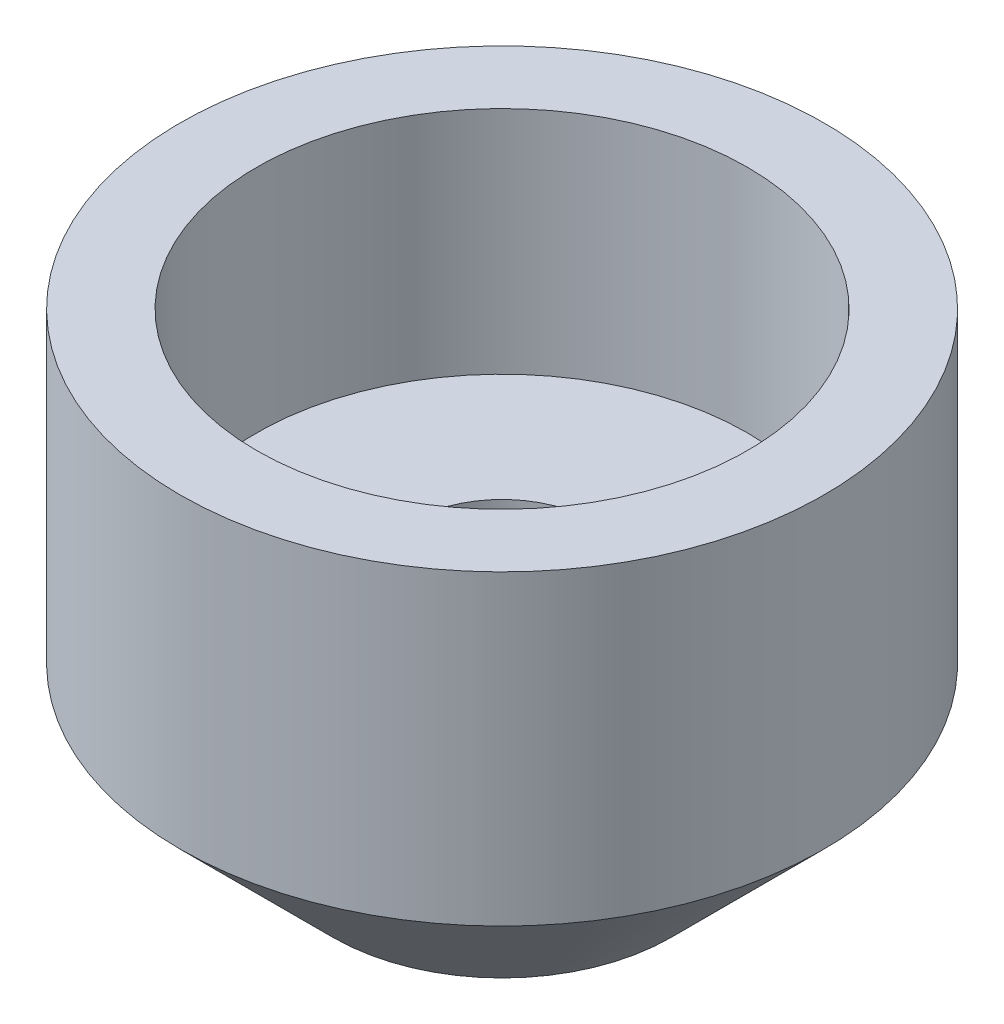
ISO-10303-21;
HEADER;
FILE_DESCRIPTION(('STEP AP214'),'2;1');
FILE_NAME('part.step','',(''),(''),'','','');
FILE_SCHEMA(('AUTOMOTIVE_DESIGN { 1 0 10303 214 1 1 1 1 }'));
ENDSEC;
DATA;
#1=APPLICATION_CONTEXT('core data for automotive mechanical design processes');
#2=APPLICATION_PROTOCOL_DEFINITION('international standard','automotive_design',2000,#1);
#3=PRODUCT_CONTEXT('',#1,'mechanical');
#4=PRODUCT('Part','Part','',(#3));
#5=PRODUCT_RELATED_PRODUCT_CATEGORY('part','',(#4));
#6=PRODUCT_DEFINITION_FORMATION('','',#4);
#7=PRODUCT_DEFINITION_CONTEXT('part definition',#1,'design');
#8=PRODUCT_DEFINITION('design','',#6,#7);
#9=PRODUCT_DEFINITION_SHAPE('','',#8);
#10=(LENGTH_UNIT() NAMED_UNIT(*) SI_UNIT(.MILLI.,.METRE.));
#11=(NAMED_UNIT(*) PLANE_ANGLE_UNIT() SI_UNIT($,.RADIAN.));
#12=(NAMED_UNIT(*) SI_UNIT($,.STERADIAN.) SOLID_ANGLE_UNIT());
#13=UNCERTAINTY_MEASURE_WITH_UNIT(LENGTH_MEASURE(1.E-05),#10,'distance_accuracy_value','');
#14=(GEOMETRIC_REPRESENTATION_CONTEXT(3) GLOBAL_UNCERTAINTY_ASSIGNED_CONTEXT((#13)) GLOBAL_UNIT_ASSIGNED_CONTEXT((#10,
#11,#12)) REPRESENTATION_CONTEXT('',''));
#15=CARTESIAN_POINT('',(0.,0.,0.));
#16=DIRECTION('',(0.,0.,1.));
#17=DIRECTION('',(1.,0.,0.));
#18=AXIS2_PLACEMENT_3D('',#15,#16,#17);
#19=CARTESIAN_POINT('',(0.,15.,0.));
#20=DIRECTION('',(0.,-1.,0.));
#21=DIRECTION('',(0.,0.,-1.));
#22=AXIS2_PLACEMENT_3D('',#19,#20,#21);
#23=CYLINDRICAL_SURFACE('',#22,10.5);
#24=CARTESIAN_POINT('',(0.,5.00000000000001,0.));
#25=DIRECTION('',(0.,1.,0.));
#26=DIRECTION('',(0.,0.,1.));
#27=AXIS2_PLACEMENT_3D('',#24,#25,#26);
#28=CIRCLE('',#27,10.5);
#29=CARTESIAN_POINT('',(0.,5.00000000000001,10.5));
#30=VERTEX_POINT('',#29);
#31=EDGE_CURVE('E41',#30,#30,#28,.T.);
#32=ORIENTED_EDGE('',*,*,#31,.T.);
#33=EDGE_LOOP('',(#32));
#34=FACE_BOUND('',#33,.T.);
#35=CARTESIAN_POINT('',(0.,15.,0.));
#36=DIRECTION('',(0.,1.,0.));
#37=DIRECTION('',(0.,0.,1.));
#38=AXIS2_PLACEMENT_3D('',#35,#36,#37);
#39=CIRCLE('',#38,10.5);
#40=CARTESIAN_POINT('',(0.,15.,10.5));
#41=VERTEX_POINT('',#40);
#42=EDGE_CURVE('E45',#41,#41,#39,.T.);
#43=ORIENTED_EDGE('',*,*,#42,.F.);
#44=EDGE_LOOP('',(#43));
#45=FACE_BOUND('',#44,.T.);
#46=ADVANCED_FACE('F34',(#34,#45),#23,.T.);
#47=CARTESIAN_POINT('',(0.,15.,0.));
#48=DIRECTION('',(0.,1.,0.));
#49=DIRECTION('',(0.,0.,1.));
#50=AXIS2_PLACEMENT_3D('',#47,#48,#49);
#51=PLANE('',#50);
#52=CARTESIAN_POINT('',(0.,15.,0.));
#53=DIRECTION('',(0.,1.,0.));
#54=DIRECTION('',(0.,0.,1.));
#55=AXIS2_PLACEMENT_3D('',#52,#53,#54);
#56=CIRCLE('',#55,8.);
#57=CARTESIAN_POINT('',(0.,15.,8.));
#58=VERTEX_POINT('',#57);
#59=EDGE_CURVE('E52',#58,#58,#56,.T.);
#60=ORIENTED_EDGE('',*,*,#59,.F.);
#61=EDGE_LOOP('',(#60));
#62=FACE_BOUND('',#61,.T.);
#63=ORIENTED_EDGE('',*,*,#42,.T.);
#64=EDGE_LOOP('',(#63));
#65=FACE_BOUND('',#64,.T.);
#66=ADVANCED_FACE('F76',(#62,#65),#51,.T.);
#67=CARTESIAN_POINT('',(0.,0.,0.));
#68=DIRECTION('',(0.,1.,0.));
#69=DIRECTION('',(0.,0.,1.));
#70=AXIS2_PLACEMENT_3D('',#67,#68,#69);
#71=PLANE('',#70);
#72=CARTESIAN_POINT('',(0.,0.,0.));
#73=DIRECTION('',(0.,1.,0.));
#74=DIRECTION('',(0.,0.,1.));
#75=AXIS2_PLACEMENT_3D('',#72,#73,#74);
#76=CIRCLE('',#75,5.49999999999997);
#77=CARTESIAN_POINT('',(0.,0.,5.49999999999997));
#78=VERTEX_POINT('',#77);
#79=EDGE_CURVE('E10',#78,#78,#76,.F.);
#80=ORIENTED_EDGE('',*,*,#79,.T.);
#81=EDGE_LOOP('',(#80));
#82=FACE_BOUND('',#81,.T.);
#83=CARTESIAN_POINT('',(0.,0.,0.));
#84=DIRECTION('',(0.,-1.,0.));
#85=DIRECTION('',(0.,0.,-1.));
#86=AXIS2_PLACEMENT_3D('',#83,#84,#85);
#87=CIRCLE('',#86,3.);
#88=CARTESIAN_POINT('',(0.,0.,-3.));
#89=VERTEX_POINT('',#88);
#90=EDGE_CURVE('E58',#89,#89,#87,.T.);
#91=ORIENTED_EDGE('',*,*,#90,.F.);
#92=EDGE_LOOP('',(#91));
#93=FACE_BOUND('',#92,.T.);
#94=ADVANCED_FACE('F73',(#82,#93),#71,.F.);
#95=CARTESIAN_POINT('',(0.,7.5,0.));
#96=DIRECTION('',(0.,1.,0.));
#97=DIRECTION('',(0.,0.,1.));
#98=AXIS2_PLACEMENT_3D('',#95,#96,#97);
#99=CYLINDRICAL_SURFACE('',#98,8.);
#100=CARTESIAN_POINT('',(0.,7.5,0.));
#101=DIRECTION('',(0.,1.,0.));
#102=DIRECTION('',(0.,0.,1.));
#103=AXIS2_PLACEMENT_3D('',#100,#101,#102);
#104=CIRCLE('',#103,8.);
#105=CARTESIAN_POINT('',(0.,7.5,8.));
#106=VERTEX_POINT('',#105);
#107=EDGE_CURVE('E49',#106,#106,#104,.T.);
#108=ORIENTED_EDGE('',*,*,#107,.F.);
#109=EDGE_LOOP('',(#108));
#110=FACE_BOUND('',#109,.T.);
#111=ORIENTED_EDGE('',*,*,#59,.T.);
#112=EDGE_LOOP('',(#111));
#113=FACE_BOUND('',#112,.T.);
#114=ADVANCED_FACE('F75',(#110,#113),#99,.F.);
#115=CARTESIAN_POINT('',(0.,7.5,0.));
#116=DIRECTION('',(0.,1.,0.));
#117=DIRECTION('',(0.,0.,1.));
#118=AXIS2_PLACEMENT_3D('',#115,#116,#117);
#119=PLANE('',#118);
#120=CARTESIAN_POINT('',(0.,7.5,0.));
#121=DIRECTION('',(0.,-1.,0.));
#122=DIRECTION('',(0.,0.,-1.));
#123=AXIS2_PLACEMENT_3D('',#120,#121,#122);
#124=CIRCLE('',#123,3.);
#125=CARTESIAN_POINT('',(0.,7.5,-3.));
#126=VERTEX_POINT('',#125);
#127=EDGE_CURVE('E55',#126,#126,#124,.T.);
#128=ORIENTED_EDGE('',*,*,#127,.T.);
#129=EDGE_LOOP('',(#128));
#130=FACE_BOUND('',#129,.T.);
#131=ORIENTED_EDGE('',*,*,#107,.T.);
#132=EDGE_LOOP('',(#131));
#133=FACE_BOUND('',#132,.T.);
#134=ADVANCED_FACE('F64',(#130,#133),#119,.T.);
#135=CARTESIAN_POINT('',(0.,7.5,0.));
#136=DIRECTION('',(0.,-1.,0.));
#137=DIRECTION('',(0.,0.,-1.));
#138=AXIS2_PLACEMENT_3D('',#135,#136,#137);
#139=CYLINDRICAL_SURFACE('',#138,3.);
#140=ORIENTED_EDGE('',*,*,#127,.F.);
#141=EDGE_LOOP('',(#140));
#142=FACE_BOUND('',#141,.T.);
#143=ORIENTED_EDGE('',*,*,#90,.T.);
#144=EDGE_LOOP('',(#143));
#145=FACE_BOUND('',#144,.T.);
#146=ADVANCED_FACE('F67',(#142,#145),#139,.F.);
#147=CARTESIAN_POINT('',(0.,5.00000000000001,0.));
#148=DIRECTION('',(0.,1.,0.));
#149=DIRECTION('',(0.,0.,1.));
#150=AXIS2_PLACEMENT_3D('',#147,#148,#149);
#151=CONICAL_SURFACE('',#150,10.5,0.78539816339745);
#152=CARTESIAN_POINT('',(0.,0.,5.49999999999997));
#153=CARTESIAN_POINT('',(0.,0.0520833333333326,5.5520833333333));
#154=CARTESIAN_POINT('',(0.,0.104166666666666,5.60416666666664));
#155=CARTESIAN_POINT('',(0.,0.208333333333333,5.7083333333333));
#156=CARTESIAN_POINT('',(0.,0.260416666666666,5.76041666666664));
#157=CARTESIAN_POINT('',(0.,0.364583333333333,5.8645833333333));
#158=CARTESIAN_POINT('',(0.,0.416666666666667,5.91666666666664));
#159=CARTESIAN_POINT('',(0.,0.520833333333334,6.02083333333331));
#160=CARTESIAN_POINT('',(0.,0.572916666666667,6.07291666666664));
#161=CARTESIAN_POINT('',(0.,0.677083333333334,6.17708333333331));
#162=CARTESIAN_POINT('',(0.,0.729166666666667,6.22916666666664));
#163=CARTESIAN_POINT('',(0.,0.833333333333334,6.33333333333331));
#164=CARTESIAN_POINT('',(0.,0.885416666666668,6.38541666666664));
#165=CARTESIAN_POINT('',(0.,0.989583333333334,6.48958333333331));
#166=CARTESIAN_POINT('',(0.,1.04166666666667,6.54166666666664));
#167=CARTESIAN_POINT('',(0.,1.14583333333334,6.64583333333331));
#168=CARTESIAN_POINT('',(0.,1.19791666666667,6.69791666666664));
#169=CARTESIAN_POINT('',(0.,1.30208333333333,6.80208333333331));
#170=CARTESIAN_POINT('',(0.,1.35416666666667,6.85416666666664));
#171=CARTESIAN_POINT('',(0.,1.45833333333334,6.95833333333331));
#172=CARTESIAN_POINT('',(0.,1.51041666666667,7.01041666666664));
#173=CARTESIAN_POINT('',(0.,1.61458333333334,7.11458333333331));
#174=CARTESIAN_POINT('',(0.,1.66666666666667,7.16666666666664));
#175=CARTESIAN_POINT('',(0.,1.77083333333334,7.27083333333331));
#176=CARTESIAN_POINT('',(0.,1.82291666666667,7.32291666666665));
#177=CARTESIAN_POINT('',(0.,1.92708333333334,7.42708333333331));
#178=CARTESIAN_POINT('',(0.,1.97916666666667,7.47916666666665));
#179=CARTESIAN_POINT('',(0.,2.08333333333334,7.58333333333331));
#180=CARTESIAN_POINT('',(0.,2.13541666666667,7.63541666666665));
#181=CARTESIAN_POINT('',(0.,2.23958333333334,7.73958333333332));
#182=CARTESIAN_POINT('',(0.,2.29166666666667,7.79166666666665));
#183=CARTESIAN_POINT('',(0.,2.39583333333334,7.89583333333332));
#184=CARTESIAN_POINT('',(0.,2.44791666666667,7.94791666666665));
#185=CARTESIAN_POINT('',(0.,2.55208333333334,8.05208333333332));
#186=CARTESIAN_POINT('',(0.,2.60416666666667,8.10416666666665));
#187=CARTESIAN_POINT('',(0.,2.70833333333334,8.20833333333332));
#188=CARTESIAN_POINT('',(0.,2.76041666666667,8.26041666666665));
#189=CARTESIAN_POINT('',(0.,2.86458333333334,8.36458333333332));
#190=CARTESIAN_POINT('',(0.,2.91666666666667,8.41666666666665));
#191=CARTESIAN_POINT('',(0.,3.02083333333334,8.52083333333332));
#192=CARTESIAN_POINT('',(0.,3.07291666666667,8.57291666666665));
#193=CARTESIAN_POINT('',(0.,3.17708333333334,8.67708333333332));
#194=CARTESIAN_POINT('',(0.,3.22916666666667,8.72916666666665));
#195=CARTESIAN_POINT('',(0.,3.33333333333334,8.83333333333332));
#196=CARTESIAN_POINT('',(0.,3.38541666666667,8.88541666666665));
#197=CARTESIAN_POINT('',(0.,3.48958333333334,8.98958333333332));
#198=CARTESIAN_POINT('',(0.,3.54166666666667,9.04166666666666));
#199=CARTESIAN_POINT('',(0.,3.64583333333334,9.14583333333332));
#200=CARTESIAN_POINT('',(0.,3.69791666666667,9.19791666666666));
#201=CARTESIAN_POINT('',(0.,3.80208333333334,9.30208333333332));
#202=CARTESIAN_POINT('',(0.,3.85416666666667,9.35416666666666));
#203=CARTESIAN_POINT('',(0.,3.95833333333334,9.45833333333333));
#204=CARTESIAN_POINT('',(0.,4.01041666666667,9.51041666666666));
#205=CARTESIAN_POINT('',(0.,4.11458333333334,9.61458333333333));
#206=CARTESIAN_POINT('',(0.,4.16666666666667,9.66666666666666));
#207=CARTESIAN_POINT('',(0.,4.27083333333334,9.77083333333333));
#208=CARTESIAN_POINT('',(0.,4.32291666666667,9.82291666666666));
#209=CARTESIAN_POINT('',(0.,4.42708333333334,9.92708333333333));
#210=CARTESIAN_POINT('',(0.,4.47916666666667,9.97916666666666));
#211=CARTESIAN_POINT('',(0.,4.58333333333334,10.0833333333333));
#212=CARTESIAN_POINT('',(0.,4.63541666666667,10.1354166666667));
#213=CARTESIAN_POINT('',(0.,4.73958333333334,10.2395833333333));
#214=CARTESIAN_POINT('',(0.,4.79166666666667,10.2916666666667));
#215=CARTESIAN_POINT('',(0.,4.89583333333334,10.3958333333333));
#216=CARTESIAN_POINT('',(0.,4.94791666666667,10.4479166666667));
#217=CARTESIAN_POINT('',(0.,5.00000000000001,10.5));
#218=B_SPLINE_CURVE_WITH_KNOTS('',3,(#152,#153,#154,#155,#156,#157,#158,#159,#160,#161,#162,
#163,#164,#165,#166,#167,#168,#169,#170,#171,#172,#173,#174,#175,#176,#177,#178,#179,#180,#181,
#182,#183,#184,#185,#186,#187,#188,#189,#190,#191,#192,#193,#194,#195,#196,#197,#198,#199,#200,
#201,#202,#203,#204,#205,#206,#207,#208,#209,#210,#211,#212,#213,#214,#215,#216,#217),
.UNSPECIFIED.,.F.,.F.,(4,2,2,2,2,2,2,2,2,2,2,2,2,2,2,2,2,2,2,2,2,2,2,2,2,2,2,2,2,2,2,2,4),(0.,
0.220970869120797,0.441941738241594,0.662912607362391,0.883883476483188,1.10485434560399,
1.32582521472478,1.54679608384558,1.76776695296638,1.98873782208717,2.20970869120797,
2.43067956032877,2.65165042944956,2.87262129857036,3.09359216769116,3.31456303681195,
3.53553390593275,3.75650477505355,3.97747564417435,4.19844651329514,4.41941738241594,
4.64038825153674,4.86135912065753,5.08232998977833,5.30330085889913,5.52427172801992,
5.74524259714072,5.96621346626152,6.18718433538232,6.40815520450311,6.62912607362391,
6.85009694274471,7.0710678118655),.UNSPECIFIED.);
#219=EDGE_CURVE('BSEAM36',#78,#30,#218,.T.);
#220=ORIENTED_EDGE('',*,*,#79,.F.);
#221=ORIENTED_EDGE('',*,*,#31,.F.);
#222=ORIENTED_EDGE('',*,*,#219,.T.);
#223=ORIENTED_EDGE('',*,*,#219,.F.);
#224=EDGE_LOOP('',(#220,#222,#221,#223));
#225=FACE_BOUND('',#224,.T.);
#226=ADVANCED_FACE('F36',(#225),#151,.T.);
#227=CLOSED_SHELL('',(#46,#66,#94,#114,#134,#146,#226));
#228=MANIFOLD_SOLID_BREP('B2',#227);
#229=ADVANCED_BREP_SHAPE_REPRESENTATION('',(#18,#228),#14);
#230=SHAPE_DEFINITION_REPRESENTATION(#9,#229);
ENDSEC;
END-ISO-10303-21;
